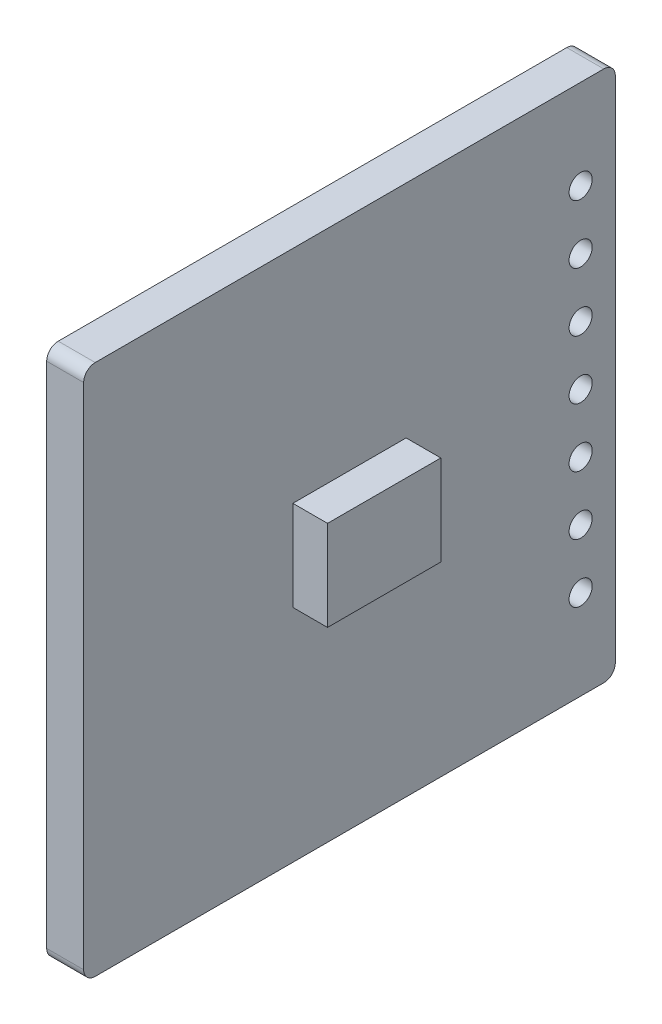
ISO-10303-21;
HEADER;
FILE_DESCRIPTION(('STEP AP214'),'2;1');
FILE_NAME('part.step','',(''),(''),'','','');
FILE_SCHEMA(('AUTOMOTIVE_DESIGN { 1 0 10303 214 1 1 1 1 }'));
ENDSEC;
DATA;
#1=APPLICATION_CONTEXT('core data for automotive mechanical design processes');
#2=APPLICATION_PROTOCOL_DEFINITION('international standard','automotive_design',2000,#1);
#3=PRODUCT_CONTEXT('',#1,'mechanical');
#4=PRODUCT('Part','Part','',(#3));
#5=PRODUCT_RELATED_PRODUCT_CATEGORY('part','',(#4));
#6=PRODUCT_DEFINITION_FORMATION('','',#4);
#7=PRODUCT_DEFINITION_CONTEXT('part definition',#1,'design');
#8=PRODUCT_DEFINITION('design','',#6,#7);
#9=PRODUCT_DEFINITION_SHAPE('','',#8);
#10=(LENGTH_UNIT() NAMED_UNIT(*) SI_UNIT(.MILLI.,.METRE.));
#11=(NAMED_UNIT(*) PLANE_ANGLE_UNIT() SI_UNIT($,.RADIAN.));
#12=(NAMED_UNIT(*) SI_UNIT($,.STERADIAN.) SOLID_ANGLE_UNIT());
#13=UNCERTAINTY_MEASURE_WITH_UNIT(LENGTH_MEASURE(1.E-05),#10,'distance_accuracy_value','');
#14=(GEOMETRIC_REPRESENTATION_CONTEXT(3) GLOBAL_UNCERTAINTY_ASSIGNED_CONTEXT((#13)) GLOBAL_UNIT_ASSIGNED_CONTEXT((#10,
#11,#12)) REPRESENTATION_CONTEXT('',''));
#15=CARTESIAN_POINT('',(0.,0.,0.));
#16=DIRECTION('',(0.,0.,1.));
#17=DIRECTION('',(1.,0.,0.));
#18=AXIS2_PLACEMENT_3D('',#15,#16,#17);
#19=CARTESIAN_POINT('',(3.1,0.,0.));
#20=DIRECTION('',(1.,0.,0.));
#21=DIRECTION('',(0.,1.,0.));
#22=AXIS2_PLACEMENT_3D('',#19,#20,#21);
#23=PLANE('',#22);
#24=DIRECTION('',(0.,1.,0.));
#25=VECTOR('',#24,1.);
#26=CARTESIAN_POINT('',(3.1,-1.95,-2.45));
#27=LINE('',#26,#25);
#28=CARTESIAN_POINT('',(3.1,-1.95,-2.45));
#29=VERTEX_POINT('',#28);
#30=CARTESIAN_POINT('',(3.1,1.95,-2.45));
#31=VERTEX_POINT('',#30);
#32=EDGE_CURVE('E189',#29,#31,#27,.T.);
#33=ORIENTED_EDGE('',*,*,#32,.T.);
#34=DIRECTION('',(0.,0.,1.));
#35=VECTOR('',#34,1.);
#36=CARTESIAN_POINT('',(3.1,1.95,-2.45));
#37=LINE('',#36,#35);
#38=CARTESIAN_POINT('',(3.1,1.95,2.45));
#39=VERTEX_POINT('',#38);
#40=EDGE_CURVE('E229',#31,#39,#37,.T.);
#41=ORIENTED_EDGE('',*,*,#40,.T.);
#42=DIRECTION('',(0.,-1.,0.));
#43=VECTOR('',#42,1.);
#44=CARTESIAN_POINT('',(3.1,1.95,2.45));
#45=LINE('',#44,#43);
#46=CARTESIAN_POINT('',(3.1,-1.95,2.45));
#47=VERTEX_POINT('',#46);
#48=EDGE_CURVE('E25',#39,#47,#45,.T.);
#49=ORIENTED_EDGE('',*,*,#48,.T.);
#50=DIRECTION('',(0.,0.,-1.));
#51=VECTOR('',#50,1.);
#52=CARTESIAN_POINT('',(3.1,-1.95,2.45));
#53=LINE('',#52,#51);
#54=EDGE_CURVE('E11',#47,#29,#53,.T.);
#55=ORIENTED_EDGE('',*,*,#54,.T.);
#56=EDGE_LOOP('',(#33,#41,#49,#55));
#57=FACE_BOUND('',#56,.T.);
#58=ADVANCED_FACE('F17',(#57),#23,.T.);
#59=CARTESIAN_POINT('',(1.6,-1.95,2.45));
#60=DIRECTION('',(0.,1.,0.));
#61=DIRECTION('',(1.,0.,0.));
#62=AXIS2_PLACEMENT_3D('',#59,#60,#61);
#63=PLANE('',#62);
#64=DIRECTION('',(0.,0.,-1.));
#65=VECTOR('',#64,1.);
#66=CARTESIAN_POINT('',(1.6,-1.95,2.45));
#67=LINE('',#66,#65);
#68=CARTESIAN_POINT('',(1.6,-1.95,2.45));
#69=VERTEX_POINT('',#68);
#70=CARTESIAN_POINT('',(1.6,-1.95,-2.45));
#71=VERTEX_POINT('',#70);
#72=EDGE_CURVE('E294',#69,#71,#67,.T.);
#73=ORIENTED_EDGE('',*,*,#72,.T.);
#74=DIRECTION('',(1.,0.,0.));
#75=VECTOR('',#74,1.);
#76=CARTESIAN_POINT('',(1.6,-1.95,-2.45));
#77=LINE('',#76,#75);
#78=EDGE_CURVE('E186',#71,#29,#77,.T.);
#79=ORIENTED_EDGE('',*,*,#78,.T.);
#80=ORIENTED_EDGE('',*,*,#54,.F.);
#81=DIRECTION('',(1.,0.,0.));
#82=VECTOR('',#81,1.);
#83=CARTESIAN_POINT('',(1.6,-1.95,2.45));
#84=LINE('',#83,#82);
#85=EDGE_CURVE('E295',#69,#47,#84,.T.);
#86=ORIENTED_EDGE('',*,*,#85,.F.);
#87=EDGE_LOOP('',(#73,#79,#80,#86));
#88=FACE_BOUND('',#87,.T.);
#89=ADVANCED_FACE('F335',(#88),#63,.F.);
#90=CARTESIAN_POINT('',(1.6,1.95,2.45));
#91=DIRECTION('',(0.,0.,-1.));
#92=DIRECTION('',(0.,-1.,0.));
#93=AXIS2_PLACEMENT_3D('',#90,#91,#92);
#94=PLANE('',#93);
#95=DIRECTION('',(0.,-1.,0.));
#96=VECTOR('',#95,1.);
#97=CARTESIAN_POINT('',(1.6,1.95,2.45));
#98=LINE('',#97,#96);
#99=CARTESIAN_POINT('',(1.6,1.95,2.45));
#100=VERTEX_POINT('',#99);
#101=EDGE_CURVE('E298',#100,#69,#98,.T.);
#102=ORIENTED_EDGE('',*,*,#101,.T.);
#103=ORIENTED_EDGE('',*,*,#85,.T.);
#104=ORIENTED_EDGE('',*,*,#48,.F.);
#105=DIRECTION('',(1.,0.,0.));
#106=VECTOR('',#105,1.);
#107=CARTESIAN_POINT('',(1.6,1.95,2.45));
#108=LINE('',#107,#106);
#109=EDGE_CURVE('E188',#100,#39,#108,.T.);
#110=ORIENTED_EDGE('',*,*,#109,.F.);
#111=EDGE_LOOP('',(#102,#103,#104,#110));
#112=FACE_BOUND('',#111,.T.);
#113=ADVANCED_FACE('F328',(#112),#94,.F.);
#114=CARTESIAN_POINT('',(1.6,1.95,-2.45));
#115=DIRECTION('',(0.,-1.,0.));
#116=DIRECTION('',(0.,0.,-1.));
#117=AXIS2_PLACEMENT_3D('',#114,#115,#116);
#118=PLANE('',#117);
#119=DIRECTION('',(0.,0.,1.));
#120=VECTOR('',#119,1.);
#121=CARTESIAN_POINT('',(1.6,1.95,-2.45));
#122=LINE('',#121,#120);
#123=CARTESIAN_POINT('',(1.6,1.95,-2.45));
#124=VERTEX_POINT('',#123);
#125=EDGE_CURVE('E303',#124,#100,#122,.T.);
#126=ORIENTED_EDGE('',*,*,#125,.T.);
#127=ORIENTED_EDGE('',*,*,#109,.T.);
#128=ORIENTED_EDGE('',*,*,#40,.F.);
#129=DIRECTION('',(1.,0.,0.));
#130=VECTOR('',#129,1.);
#131=CARTESIAN_POINT('',(1.6,1.95,-2.45));
#132=LINE('',#131,#130);
#133=EDGE_CURVE('E321',#124,#31,#132,.T.);
#134=ORIENTED_EDGE('',*,*,#133,.F.);
#135=EDGE_LOOP('',(#126,#127,#128,#134));
#136=FACE_BOUND('',#135,.T.);
#137=ADVANCED_FACE('F343',(#136),#118,.F.);
#138=CARTESIAN_POINT('',(1.6,-1.95,-2.45));
#139=DIRECTION('',(0.,0.,1.));
#140=DIRECTION('',(1.,0.,0.));
#141=AXIS2_PLACEMENT_3D('',#138,#139,#140);
#142=PLANE('',#141);
#143=DIRECTION('',(0.,1.,0.));
#144=VECTOR('',#143,1.);
#145=CARTESIAN_POINT('',(1.6,-1.95,-2.45));
#146=LINE('',#145,#144);
#147=EDGE_CURVE('E288',#71,#124,#146,.T.);
#148=ORIENTED_EDGE('',*,*,#147,.T.);
#149=ORIENTED_EDGE('',*,*,#133,.T.);
#150=ORIENTED_EDGE('',*,*,#32,.F.);
#151=ORIENTED_EDGE('',*,*,#78,.F.);
#152=EDGE_LOOP('',(#148,#149,#150,#151));
#153=FACE_BOUND('',#152,.T.);
#154=ADVANCED_FACE('F340',(#153),#142,.F.);
#155=CARTESIAN_POINT('',(0.,-7.62,-10.));
#156=DIRECTION('',(-1.,0.,0.));
#157=DIRECTION('',(0.,1.,0.));
#158=AXIS2_PLACEMENT_3D('',#155,#156,#157);
#159=CYLINDRICAL_SURFACE('',#158,0.5);
#160=CARTESIAN_POINT('',(1.6,-7.62,-10.));
#161=DIRECTION('',(-1.,0.,0.));
#162=DIRECTION('',(0.,1.,0.));
#163=AXIS2_PLACEMENT_3D('',#160,#161,#162);
#164=CIRCLE('',#163,0.5);
#165=CARTESIAN_POINT('',(1.6,-7.12,-10.));
#166=VERTEX_POINT('',#165);
#167=EDGE_CURVE('E283',#166,#166,#164,.T.);
#168=ORIENTED_EDGE('',*,*,#167,.F.);
#169=EDGE_LOOP('',(#168));
#170=FACE_BOUND('',#169,.T.);
#171=CARTESIAN_POINT('',(0.,-7.62,-10.));
#172=DIRECTION('',(1.,0.,0.));
#173=DIRECTION('',(0.,1.,0.));
#174=AXIS2_PLACEMENT_3D('',#171,#172,#173);
#175=CIRCLE('',#174,0.5);
#176=CARTESIAN_POINT('',(0.,-7.12,-10.));
#177=VERTEX_POINT('',#176);
#178=EDGE_CURVE('E235',#177,#177,#175,.T.);
#179=ORIENTED_EDGE('',*,*,#178,.F.);
#180=EDGE_LOOP('',(#179));
#181=FACE_BOUND('',#180,.T.);
#182=ADVANCED_FACE('F351',(#170,#181),#159,.F.);
#183=CARTESIAN_POINT('',(0.,-5.08,-10.));
#184=DIRECTION('',(-1.,0.,0.));
#185=DIRECTION('',(0.,1.,0.));
#186=AXIS2_PLACEMENT_3D('',#183,#184,#185);
#187=CYLINDRICAL_SURFACE('',#186,0.5);
#188=CARTESIAN_POINT('',(1.6,-5.08,-10.));
#189=DIRECTION('',(-1.,0.,0.));
#190=DIRECTION('',(0.,1.,0.));
#191=AXIS2_PLACEMENT_3D('',#188,#189,#190);
#192=CIRCLE('',#191,0.5);
#193=CARTESIAN_POINT('',(1.6,-4.58,-10.));
#194=VERTEX_POINT('',#193);
#195=EDGE_CURVE('E278',#194,#194,#192,.T.);
#196=ORIENTED_EDGE('',*,*,#195,.F.);
#197=EDGE_LOOP('',(#196));
#198=FACE_BOUND('',#197,.T.);
#199=CARTESIAN_POINT('',(0.,-5.08,-10.));
#200=DIRECTION('',(1.,0.,0.));
#201=DIRECTION('',(0.,1.,0.));
#202=AXIS2_PLACEMENT_3D('',#199,#200,#201);
#203=CIRCLE('',#202,0.5);
#204=CARTESIAN_POINT('',(0.,-4.58,-10.));
#205=VERTEX_POINT('',#204);
#206=EDGE_CURVE('E182',#205,#205,#203,.T.);
#207=ORIENTED_EDGE('',*,*,#206,.F.);
#208=EDGE_LOOP('',(#207));
#209=FACE_BOUND('',#208,.T.);
#210=ADVANCED_FACE('F483',(#198,#209),#187,.F.);
#211=CARTESIAN_POINT('',(0.,-2.54,-10.));
#212=DIRECTION('',(-1.,0.,0.));
#213=DIRECTION('',(0.,1.,0.));
#214=AXIS2_PLACEMENT_3D('',#211,#212,#213);
#215=CYLINDRICAL_SURFACE('',#214,0.5);
#216=CARTESIAN_POINT('',(1.6,-2.54,-10.));
#217=DIRECTION('',(-1.,0.,0.));
#218=DIRECTION('',(0.,1.,0.));
#219=AXIS2_PLACEMENT_3D('',#216,#217,#218);
#220=CIRCLE('',#219,0.5);
#221=CARTESIAN_POINT('',(1.6,-2.04,-10.));
#222=VERTEX_POINT('',#221);
#223=EDGE_CURVE('E277',#222,#222,#220,.T.);
#224=ORIENTED_EDGE('',*,*,#223,.F.);
#225=EDGE_LOOP('',(#224));
#226=FACE_BOUND('',#225,.T.);
#227=CARTESIAN_POINT('',(0.,-2.54,-10.));
#228=DIRECTION('',(1.,0.,0.));
#229=DIRECTION('',(0.,1.,0.));
#230=AXIS2_PLACEMENT_3D('',#227,#228,#229);
#231=CIRCLE('',#230,0.5);
#232=CARTESIAN_POINT('',(0.,-2.04,-10.));
#233=VERTEX_POINT('',#232);
#234=EDGE_CURVE('E179',#233,#233,#231,.T.);
#235=ORIENTED_EDGE('',*,*,#234,.F.);
#236=EDGE_LOOP('',(#235));
#237=FACE_BOUND('',#236,.T.);
#238=ADVANCED_FACE('F490',(#226,#237),#215,.F.);
#239=CARTESIAN_POINT('',(0.,0.,-10.));
#240=DIRECTION('',(-1.,0.,0.));
#241=DIRECTION('',(0.,1.,0.));
#242=AXIS2_PLACEMENT_3D('',#239,#240,#241);
#243=CYLINDRICAL_SURFACE('',#242,0.5);
#244=CARTESIAN_POINT('',(1.6,0.,-10.));
#245=DIRECTION('',(-1.,0.,0.));
#246=DIRECTION('',(0.,1.,0.));
#247=AXIS2_PLACEMENT_3D('',#244,#245,#246);
#248=CIRCLE('',#247,0.5);
#249=CARTESIAN_POINT('',(1.6,0.5,-10.));
#250=VERTEX_POINT('',#249);
#251=EDGE_CURVE('E275',#250,#250,#248,.T.);
#252=ORIENTED_EDGE('',*,*,#251,.F.);
#253=EDGE_LOOP('',(#252));
#254=FACE_BOUND('',#253,.T.);
#255=CARTESIAN_POINT('',(0.,0.,-10.));
#256=DIRECTION('',(1.,0.,0.));
#257=DIRECTION('',(0.,1.,0.));
#258=AXIS2_PLACEMENT_3D('',#255,#256,#257);
#259=CIRCLE('',#258,0.5);
#260=CARTESIAN_POINT('',(0.,0.5,-10.));
#261=VERTEX_POINT('',#260);
#262=EDGE_CURVE('E184',#261,#261,#259,.T.);
#263=ORIENTED_EDGE('',*,*,#262,.F.);
#264=EDGE_LOOP('',(#263));
#265=FACE_BOUND('',#264,.T.);
#266=ADVANCED_FACE('F474',(#254,#265),#243,.F.);
#267=CARTESIAN_POINT('',(0.,2.54,-10.));
#268=DIRECTION('',(-1.,0.,0.));
#269=DIRECTION('',(0.,1.,0.));
#270=AXIS2_PLACEMENT_3D('',#267,#268,#269);
#271=CYLINDRICAL_SURFACE('',#270,0.5);
#272=CARTESIAN_POINT('',(1.6,2.54,-10.));
#273=DIRECTION('',(-1.,0.,0.));
#274=DIRECTION('',(0.,1.,0.));
#275=AXIS2_PLACEMENT_3D('',#272,#273,#274);
#276=CIRCLE('',#275,0.5);
#277=CARTESIAN_POINT('',(1.6,3.04,-10.));
#278=VERTEX_POINT('',#277);
#279=EDGE_CURVE('E268',#278,#278,#276,.T.);
#280=ORIENTED_EDGE('',*,*,#279,.F.);
#281=EDGE_LOOP('',(#280));
#282=FACE_BOUND('',#281,.T.);
#283=CARTESIAN_POINT('',(0.,2.54,-10.));
#284=DIRECTION('',(1.,0.,0.));
#285=DIRECTION('',(0.,1.,0.));
#286=AXIS2_PLACEMENT_3D('',#283,#284,#285);
#287=CIRCLE('',#286,0.5);
#288=CARTESIAN_POINT('',(0.,3.04,-10.));
#289=VERTEX_POINT('',#288);
#290=EDGE_CURVE('E174',#289,#289,#287,.T.);
#291=ORIENTED_EDGE('',*,*,#290,.F.);
#292=EDGE_LOOP('',(#291));
#293=FACE_BOUND('',#292,.T.);
#294=ADVANCED_FACE('F455',(#282,#293),#271,.F.);
#295=CARTESIAN_POINT('',(0.,5.08,-10.));
#296=DIRECTION('',(-1.,0.,0.));
#297=DIRECTION('',(0.,1.,0.));
#298=AXIS2_PLACEMENT_3D('',#295,#296,#297);
#299=CYLINDRICAL_SURFACE('',#298,0.5);
#300=CARTESIAN_POINT('',(1.6,5.08,-10.));
#301=DIRECTION('',(-1.,0.,0.));
#302=DIRECTION('',(0.,1.,0.));
#303=AXIS2_PLACEMENT_3D('',#300,#301,#302);
#304=CIRCLE('',#303,0.5);
#305=CARTESIAN_POINT('',(1.6,5.58,-10.));
#306=VERTEX_POINT('',#305);
#307=EDGE_CURVE('E262',#306,#306,#304,.T.);
#308=ORIENTED_EDGE('',*,*,#307,.F.);
#309=EDGE_LOOP('',(#308));
#310=FACE_BOUND('',#309,.T.);
#311=CARTESIAN_POINT('',(0.,5.08,-10.));
#312=DIRECTION('',(1.,0.,0.));
#313=DIRECTION('',(0.,1.,0.));
#314=AXIS2_PLACEMENT_3D('',#311,#312,#313);
#315=CIRCLE('',#314,0.5);
#316=CARTESIAN_POINT('',(0.,5.58,-10.));
#317=VERTEX_POINT('',#316);
#318=EDGE_CURVE('E171',#317,#317,#315,.T.);
#319=ORIENTED_EDGE('',*,*,#318,.F.);
#320=EDGE_LOOP('',(#319));
#321=FACE_BOUND('',#320,.T.);
#322=ADVANCED_FACE('F449',(#310,#321),#299,.F.);
#323=CARTESIAN_POINT('',(0.,7.62,-10.));
#324=DIRECTION('',(-1.,0.,0.));
#325=DIRECTION('',(0.,1.,0.));
#326=AXIS2_PLACEMENT_3D('',#323,#324,#325);
#327=CYLINDRICAL_SURFACE('',#326,0.5);
#328=CARTESIAN_POINT('',(1.6,7.62,-10.));
#329=DIRECTION('',(-1.,0.,0.));
#330=DIRECTION('',(0.,1.,0.));
#331=AXIS2_PLACEMENT_3D('',#328,#329,#330);
#332=CIRCLE('',#331,0.5);
#333=CARTESIAN_POINT('',(1.6,8.12,-10.));
#334=VERTEX_POINT('',#333);
#335=EDGE_CURVE('E257',#334,#334,#332,.T.);
#336=ORIENTED_EDGE('',*,*,#335,.F.);
#337=EDGE_LOOP('',(#336));
#338=FACE_BOUND('',#337,.T.);
#339=CARTESIAN_POINT('',(0.,7.62,-10.));
#340=DIRECTION('',(1.,0.,0.));
#341=DIRECTION('',(0.,1.,0.));
#342=AXIS2_PLACEMENT_3D('',#339,#340,#341);
#343=CIRCLE('',#342,0.5);
#344=CARTESIAN_POINT('',(0.,8.12,-10.));
#345=VERTEX_POINT('',#344);
#346=EDGE_CURVE('E150',#345,#345,#343,.T.);
#347=ORIENTED_EDGE('',*,*,#346,.F.);
#348=EDGE_LOOP('',(#347));
#349=FACE_BOUND('',#348,.T.);
#350=ADVANCED_FACE('F443',(#338,#349),#327,.F.);
#351=CARTESIAN_POINT('',(0.,11.5,11.5));
#352=DIRECTION('',(0.,0.,-1.));
#353=DIRECTION('',(0.,-1.,0.));
#354=AXIS2_PLACEMENT_3D('',#351,#352,#353);
#355=PLANE('',#354);
#356=DIRECTION('',(1.,0.,0.));
#357=VECTOR('',#356,1.);
#358=CARTESIAN_POINT('',(0.,-11.,11.5));
#359=LINE('',#358,#357);
#360=CARTESIAN_POINT('',(0.,-11.,11.5));
#361=VERTEX_POINT('',#360);
#362=CARTESIAN_POINT('',(1.6,-11.,11.5));
#363=VERTEX_POINT('',#362);
#364=EDGE_CURVE('E311',#361,#363,#359,.T.);
#365=ORIENTED_EDGE('',*,*,#364,.T.);
#366=DIRECTION('',(0.,-1.,0.));
#367=VECTOR('',#366,1.);
#368=CARTESIAN_POINT('',(1.6,11.5,11.5));
#369=LINE('',#368,#367);
#370=CARTESIAN_POINT('',(1.6,11.,11.5));
#371=VERTEX_POINT('',#370);
#372=EDGE_CURVE('E247',#371,#363,#369,.T.);
#373=ORIENTED_EDGE('',*,*,#372,.F.);
#374=DIRECTION('',(1.,0.,0.));
#375=VECTOR('',#374,1.);
#376=CARTESIAN_POINT('',(0.,11.,11.5));
#377=LINE('',#376,#375);
#378=CARTESIAN_POINT('',(0.,11.,11.5));
#379=VERTEX_POINT('',#378);
#380=EDGE_CURVE('E318',#379,#371,#377,.T.);
#381=ORIENTED_EDGE('',*,*,#380,.F.);
#382=DIRECTION('',(0.,-1.,0.));
#383=VECTOR('',#382,1.);
#384=CARTESIAN_POINT('',(0.,11.5,11.5));
#385=LINE('',#384,#383);
#386=EDGE_CURVE('E196',#379,#361,#385,.T.);
#387=ORIENTED_EDGE('',*,*,#386,.T.);
#388=EDGE_LOOP('',(#365,#373,#381,#387));
#389=FACE_BOUND('',#388,.T.);
#390=ADVANCED_FACE('F466',(#389),#355,.F.);
#391=CARTESIAN_POINT('',(0.,11.,11.));
#392=DIRECTION('',(1.,0.,0.));
#393=DIRECTION('',(0.,1.,0.));
#394=AXIS2_PLACEMENT_3D('',#391,#392,#393);
#395=CYLINDRICAL_SURFACE('',#394,0.5);
#396=CARTESIAN_POINT('',(0.,11.,11.));
#397=DIRECTION('',(1.,0.,0.));
#398=DIRECTION('',(0.,0.,1.));
#399=AXIS2_PLACEMENT_3D('',#396,#397,#398);
#400=CIRCLE('',#399,0.5);
#401=CARTESIAN_POINT('',(0.,11.5,11.));
#402=VERTEX_POINT('',#401);
#403=EDGE_CURVE('E202',#402,#379,#400,.T.);
#404=ORIENTED_EDGE('',*,*,#403,.T.);
#405=ORIENTED_EDGE('',*,*,#380,.T.);
#406=CARTESIAN_POINT('',(1.6,11.,11.));
#407=DIRECTION('',(1.,0.,0.));
#408=DIRECTION('',(0.,0.,1.));
#409=AXIS2_PLACEMENT_3D('',#406,#407,#408);
#410=CIRCLE('',#409,0.5);
#411=CARTESIAN_POINT('',(1.6,11.5,11.));
#412=VERTEX_POINT('',#411);
#413=EDGE_CURVE('E244',#412,#371,#410,.T.);
#414=ORIENTED_EDGE('',*,*,#413,.F.);
#415=DIRECTION('',(1.,0.,0.));
#416=VECTOR('',#415,1.);
#417=CARTESIAN_POINT('',(0.,11.5,11.));
#418=LINE('',#417,#416);
#419=EDGE_CURVE('E309',#402,#412,#418,.T.);
#420=ORIENTED_EDGE('',*,*,#419,.F.);
#421=EDGE_LOOP('',(#404,#405,#414,#420));
#422=FACE_BOUND('',#421,.T.);
#423=ADVANCED_FACE('F459',(#422),#395,.T.);
#424=CARTESIAN_POINT('',(0.,-11.,11.));
#425=DIRECTION('',(1.,0.,0.));
#426=DIRECTION('',(0.,0.,1.));
#427=AXIS2_PLACEMENT_3D('',#424,#425,#426);
#428=CYLINDRICAL_SURFACE('',#427,0.5);
#429=CARTESIAN_POINT('',(0.,-11.,11.));
#430=DIRECTION('',(1.,0.,0.));
#431=DIRECTION('',(0.,0.,1.));
#432=AXIS2_PLACEMENT_3D('',#429,#430,#431);
#433=CIRCLE('',#432,0.5);
#434=CARTESIAN_POINT('',(0.,-11.5,11.));
#435=VERTEX_POINT('',#434);
#436=EDGE_CURVE('E192',#361,#435,#433,.T.);
#437=ORIENTED_EDGE('',*,*,#436,.T.);
#438=DIRECTION('',(1.,0.,0.));
#439=VECTOR('',#438,1.);
#440=CARTESIAN_POINT('',(0.,-11.5,11.));
#441=LINE('',#440,#439);
#442=CARTESIAN_POINT('',(1.6,-11.5,11.));
#443=VERTEX_POINT('',#442);
#444=EDGE_CURVE('E307',#435,#443,#441,.T.);
#445=ORIENTED_EDGE('',*,*,#444,.T.);
#446=CARTESIAN_POINT('',(1.6,-11.,11.));
#447=DIRECTION('',(1.,0.,0.));
#448=DIRECTION('',(0.,0.,1.));
#449=AXIS2_PLACEMENT_3D('',#446,#447,#448);
#450=CIRCLE('',#449,0.5);
#451=EDGE_CURVE('E251',#363,#443,#450,.T.);
#452=ORIENTED_EDGE('',*,*,#451,.F.);
#453=ORIENTED_EDGE('',*,*,#364,.F.);
#454=EDGE_LOOP('',(#437,#445,#452,#453));
#455=FACE_BOUND('',#454,.T.);
#456=ADVANCED_FACE('F464',(#455),#428,.T.);
#457=CARTESIAN_POINT('',(0.,11.5,-11.5));
#458=DIRECTION('',(0.,-1.,0.));
#459=DIRECTION('',(0.,0.,-1.));
#460=AXIS2_PLACEMENT_3D('',#457,#458,#459);
#461=PLANE('',#460);
#462=ORIENTED_EDGE('',*,*,#419,.T.);
#463=DIRECTION('',(0.,0.,1.));
#464=VECTOR('',#463,1.);
#465=CARTESIAN_POINT('',(1.6,11.5,-11.5));
#466=LINE('',#465,#464);
#467=CARTESIAN_POINT('',(1.6,11.5,-11.));
#468=VERTEX_POINT('',#467);
#469=EDGE_CURVE('E241',#468,#412,#466,.T.);
#470=ORIENTED_EDGE('',*,*,#469,.F.);
#471=DIRECTION('',(1.,0.,0.));
#472=VECTOR('',#471,1.);
#473=CARTESIAN_POINT('',(0.,11.5,-11.));
#474=LINE('',#473,#472);
#475=CARTESIAN_POINT('',(0.,11.5,-11.));
#476=VERTEX_POINT('',#475);
#477=EDGE_CURVE('E220',#476,#468,#474,.T.);
#478=ORIENTED_EDGE('',*,*,#477,.F.);
#479=DIRECTION('',(0.,0.,1.));
#480=VECTOR('',#479,1.);
#481=CARTESIAN_POINT('',(0.,11.5,-11.5));
#482=LINE('',#481,#480);
#483=EDGE_CURVE('E142',#476,#402,#482,.T.);
#484=ORIENTED_EDGE('',*,*,#483,.T.);
#485=EDGE_LOOP('',(#462,#470,#478,#484));
#486=FACE_BOUND('',#485,.T.);
#487=ADVANCED_FACE('F496',(#486),#461,.F.);
#488=CARTESIAN_POINT('',(0.,-11.5,11.5));
#489=DIRECTION('',(0.,1.,0.));
#490=DIRECTION('',(1.,0.,0.));
#491=AXIS2_PLACEMENT_3D('',#488,#489,#490);
#492=PLANE('',#491);
#493=DIRECTION('',(1.,0.,0.));
#494=VECTOR('',#493,1.);
#495=CARTESIAN_POINT('',(0.,-11.5,-11.));
#496=LINE('',#495,#494);
#497=CARTESIAN_POINT('',(0.,-11.5,-11.));
#498=VERTEX_POINT('',#497);
#499=CARTESIAN_POINT('',(1.6,-11.5,-11.));
#500=VERTEX_POINT('',#499);
#501=EDGE_CURVE('E212',#498,#500,#496,.T.);
#502=ORIENTED_EDGE('',*,*,#501,.T.);
#503=DIRECTION('',(0.,0.,-1.));
#504=VECTOR('',#503,1.);
#505=CARTESIAN_POINT('',(1.6,-11.5,11.5));
#506=LINE('',#505,#504);
#507=EDGE_CURVE('E260',#443,#500,#506,.T.);
#508=ORIENTED_EDGE('',*,*,#507,.F.);
#509=ORIENTED_EDGE('',*,*,#444,.F.);
#510=DIRECTION('',(0.,0.,-1.));
#511=VECTOR('',#510,1.);
#512=CARTESIAN_POINT('',(0.,-11.5,11.5));
#513=LINE('',#512,#511);
#514=EDGE_CURVE('E178',#435,#498,#513,.T.);
#515=ORIENTED_EDGE('',*,*,#514,.T.);
#516=EDGE_LOOP('',(#502,#508,#509,#515));
#517=FACE_BOUND('',#516,.T.);
#518=ADVANCED_FACE('F390',(#517),#492,.F.);
#519=CARTESIAN_POINT('',(1.6,0.,0.));
#520=DIRECTION('',(1.,0.,0.));
#521=DIRECTION('',(0.,1.,0.));
#522=AXIS2_PLACEMENT_3D('',#519,#520,#521);
#523=PLANE('',#522);
#524=ORIENTED_EDGE('',*,*,#147,.F.);
#525=ORIENTED_EDGE('',*,*,#72,.F.);
#526=ORIENTED_EDGE('',*,*,#101,.F.);
#527=ORIENTED_EDGE('',*,*,#125,.F.);
#528=EDGE_LOOP('',(#524,#525,#526,#527));
#529=FACE_BOUND('',#528,.T.);
#530=ORIENTED_EDGE('',*,*,#167,.T.);
#531=EDGE_LOOP('',(#530));
#532=FACE_BOUND('',#531,.T.);
#533=ORIENTED_EDGE('',*,*,#195,.T.);
#534=EDGE_LOOP('',(#533));
#535=FACE_BOUND('',#534,.T.);
#536=ORIENTED_EDGE('',*,*,#223,.T.);
#537=EDGE_LOOP('',(#536));
#538=FACE_BOUND('',#537,.T.);
#539=ORIENTED_EDGE('',*,*,#251,.T.);
#540=EDGE_LOOP('',(#539));
#541=FACE_BOUND('',#540,.T.);
#542=ORIENTED_EDGE('',*,*,#279,.T.);
#543=EDGE_LOOP('',(#542));
#544=FACE_BOUND('',#543,.T.);
#545=ORIENTED_EDGE('',*,*,#307,.T.);
#546=EDGE_LOOP('',(#545));
#547=FACE_BOUND('',#546,.T.);
#548=ORIENTED_EDGE('',*,*,#335,.T.);
#549=EDGE_LOOP('',(#548));
#550=FACE_BOUND('',#549,.T.);
#551=DIRECTION('',(0.,1.,0.));
#552=VECTOR('',#551,1.);
#553=CARTESIAN_POINT('',(1.6,-11.5,-11.5));
#554=LINE('',#553,#552);
#555=CARTESIAN_POINT('',(1.6,-11.,-11.5));
#556=VERTEX_POINT('',#555);
#557=CARTESIAN_POINT('',(1.6,11.,-11.5));
#558=VERTEX_POINT('',#557);
#559=EDGE_CURVE('E163',#556,#558,#554,.T.);
#560=ORIENTED_EDGE('',*,*,#559,.T.);
#561=CARTESIAN_POINT('',(1.6,11.,-11.));
#562=DIRECTION('',(1.,0.,0.));
#563=DIRECTION('',(0.,0.,1.));
#564=AXIS2_PLACEMENT_3D('',#561,#562,#563);
#565=CIRCLE('',#564,0.5);
#566=EDGE_CURVE('E161',#558,#468,#565,.T.);
#567=ORIENTED_EDGE('',*,*,#566,.T.);
#568=ORIENTED_EDGE('',*,*,#469,.T.);
#569=ORIENTED_EDGE('',*,*,#413,.T.);
#570=ORIENTED_EDGE('',*,*,#372,.T.);
#571=ORIENTED_EDGE('',*,*,#451,.T.);
#572=ORIENTED_EDGE('',*,*,#507,.T.);
#573=CARTESIAN_POINT('',(1.6,-11.,-11.));
#574=DIRECTION('',(-1.,0.,0.));
#575=DIRECTION('',(0.,0.,1.));
#576=AXIS2_PLACEMENT_3D('',#573,#574,#575);
#577=CIRCLE('',#576,0.5);
#578=EDGE_CURVE('E217',#556,#500,#577,.T.);
#579=ORIENTED_EDGE('',*,*,#578,.F.);
#580=EDGE_LOOP('',(#560,#567,#568,#569,#570,#571,#572,#579));
#581=FACE_BOUND('',#580,.T.);
#582=ADVANCED_FACE('F337',(#529,#532,#535,#538,#541,#544,#547,#550,#581),#523,.T.);
#583=CARTESIAN_POINT('',(0.,11.,-11.));
#584=DIRECTION('',(1.,0.,0.));
#585=DIRECTION('',(0.,0.,-1.));
#586=AXIS2_PLACEMENT_3D('',#583,#584,#585);
#587=CYLINDRICAL_SURFACE('',#586,0.5);
#588=CARTESIAN_POINT('',(0.,11.,-11.));
#589=DIRECTION('',(1.,0.,0.));
#590=DIRECTION('',(0.,0.,1.));
#591=AXIS2_PLACEMENT_3D('',#588,#589,#590);
#592=CIRCLE('',#591,0.5);
#593=CARTESIAN_POINT('',(0.,11.,-11.5));
#594=VERTEX_POINT('',#593);
#595=EDGE_CURVE('E133',#594,#476,#592,.T.);
#596=ORIENTED_EDGE('',*,*,#595,.T.);
#597=ORIENTED_EDGE('',*,*,#477,.T.);
#598=ORIENTED_EDGE('',*,*,#566,.F.);
#599=DIRECTION('',(1.,0.,0.));
#600=VECTOR('',#599,1.);
#601=CARTESIAN_POINT('',(0.,11.,-11.5));
#602=LINE('',#601,#600);
#603=EDGE_CURVE('E153',#594,#558,#602,.T.);
#604=ORIENTED_EDGE('',*,*,#603,.F.);
#605=EDGE_LOOP('',(#596,#597,#598,#604));
#606=FACE_BOUND('',#605,.T.);
#607=ADVANCED_FACE('F157',(#606),#587,.T.);
#608=CARTESIAN_POINT('',(0.,-11.,-11.));
#609=DIRECTION('',(1.,0.,0.));
#610=DIRECTION('',(0.,0.,-1.));
#611=AXIS2_PLACEMENT_3D('',#608,#609,#610);
#612=CYLINDRICAL_SURFACE('',#611,0.5);
#613=DIRECTION('',(1.,0.,0.));
#614=VECTOR('',#613,1.);
#615=CARTESIAN_POINT('',(0.,-11.,-11.5));
#616=LINE('',#615,#614);
#617=CARTESIAN_POINT('',(0.,-11.,-11.5));
#618=VERTEX_POINT('',#617);
#619=EDGE_CURVE('E154',#618,#556,#616,.T.);
#620=ORIENTED_EDGE('',*,*,#619,.T.);
#621=ORIENTED_EDGE('',*,*,#578,.T.);
#622=ORIENTED_EDGE('',*,*,#501,.F.);
#623=CARTESIAN_POINT('',(0.,-11.,-11.));
#624=DIRECTION('',(-1.,0.,0.));
#625=DIRECTION('',(0.,0.,1.));
#626=AXIS2_PLACEMENT_3D('',#623,#624,#625);
#627=CIRCLE('',#626,0.5);
#628=EDGE_CURVE('E160',#618,#498,#627,.T.);
#629=ORIENTED_EDGE('',*,*,#628,.F.);
#630=EDGE_LOOP('',(#620,#621,#622,#629));
#631=FACE_BOUND('',#630,.T.);
#632=ADVANCED_FACE('F411',(#631),#612,.T.);
#633=CARTESIAN_POINT('',(0.,0.,0.));
#634=DIRECTION('',(1.,0.,0.));
#635=DIRECTION('',(0.,1.,0.));
#636=AXIS2_PLACEMENT_3D('',#633,#634,#635);
#637=PLANE('',#636);
#638=ORIENTED_EDGE('',*,*,#178,.T.);
#639=EDGE_LOOP('',(#638));
#640=FACE_BOUND('',#639,.T.);
#641=ORIENTED_EDGE('',*,*,#206,.T.);
#642=EDGE_LOOP('',(#641));
#643=FACE_BOUND('',#642,.T.);
#644=ORIENTED_EDGE('',*,*,#234,.T.);
#645=EDGE_LOOP('',(#644));
#646=FACE_BOUND('',#645,.T.);
#647=ORIENTED_EDGE('',*,*,#262,.T.);
#648=EDGE_LOOP('',(#647));
#649=FACE_BOUND('',#648,.T.);
#650=ORIENTED_EDGE('',*,*,#290,.T.);
#651=EDGE_LOOP('',(#650));
#652=FACE_BOUND('',#651,.T.);
#653=ORIENTED_EDGE('',*,*,#318,.T.);
#654=EDGE_LOOP('',(#653));
#655=FACE_BOUND('',#654,.T.);
#656=ORIENTED_EDGE('',*,*,#346,.T.);
#657=EDGE_LOOP('',(#656));
#658=FACE_BOUND('',#657,.T.);
#659=ORIENTED_EDGE('',*,*,#628,.T.);
#660=ORIENTED_EDGE('',*,*,#514,.F.);
#661=ORIENTED_EDGE('',*,*,#436,.F.);
#662=ORIENTED_EDGE('',*,*,#386,.F.);
#663=ORIENTED_EDGE('',*,*,#403,.F.);
#664=ORIENTED_EDGE('',*,*,#483,.F.);
#665=ORIENTED_EDGE('',*,*,#595,.F.);
#666=DIRECTION('',(0.,1.,0.));
#667=VECTOR('',#666,1.);
#668=CARTESIAN_POINT('',(0.,-11.5,-11.5));
#669=LINE('',#668,#667);
#670=EDGE_CURVE('E138',#618,#594,#669,.T.);
#671=ORIENTED_EDGE('',*,*,#670,.F.);
#672=EDGE_LOOP('',(#659,#660,#661,#662,#663,#664,#665,#671));
#673=FACE_BOUND('',#672,.T.);
#674=ADVANCED_FACE('F140',(#640,#643,#646,#649,#652,#655,#658,#673),#637,.F.);
#675=CARTESIAN_POINT('',(0.,-11.5,-11.5));
#676=DIRECTION('',(0.,0.,1.));
#677=DIRECTION('',(1.,0.,0.));
#678=AXIS2_PLACEMENT_3D('',#675,#676,#677);
#679=PLANE('',#678);
#680=ORIENTED_EDGE('',*,*,#603,.T.);
#681=ORIENTED_EDGE('',*,*,#559,.F.);
#682=ORIENTED_EDGE('',*,*,#619,.F.);
#683=ORIENTED_EDGE('',*,*,#670,.T.);
#684=EDGE_LOOP('',(#680,#681,#682,#683));
#685=FACE_BOUND('',#684,.T.);
#686=ADVANCED_FACE('F151',(#685),#679,.F.);
#687=CLOSED_SHELL('',(#58,#89,#113,#137,#154,#182,#210,#238,#266,#294,#322,#350,#390,#423,#456,
#487,#518,#582,#607,#632,#674,#686));
#688=MANIFOLD_SOLID_BREP('B1',#687);
#689=ADVANCED_BREP_SHAPE_REPRESENTATION('',(#18,#688),#14);
#690=SHAPE_DEFINITION_REPRESENTATION(#9,#689);
ENDSEC;
END-ISO-10303-21;
